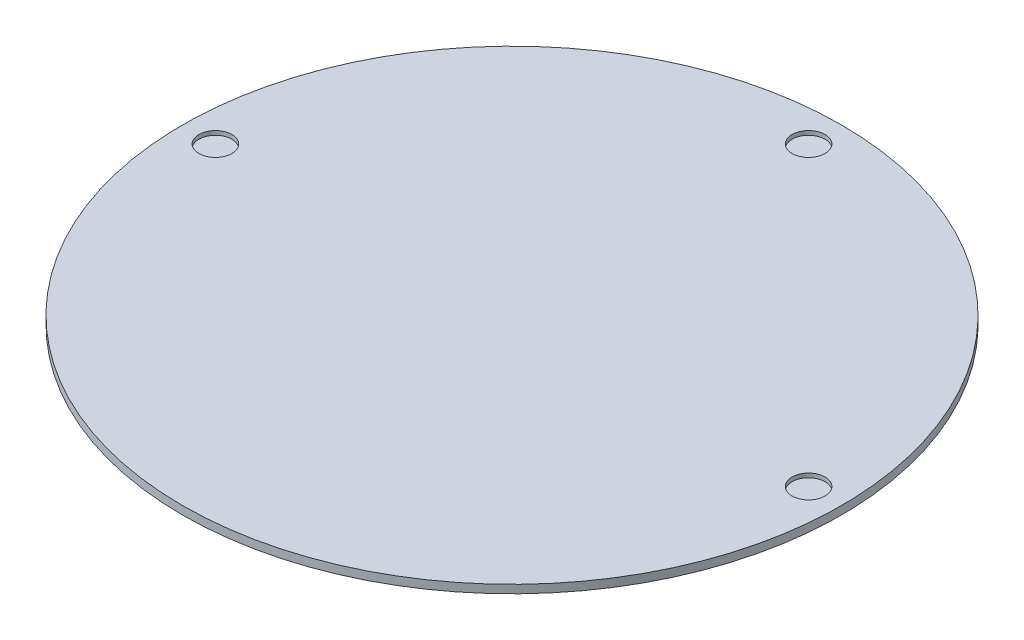
ISO-10303-21;
HEADER;
FILE_DESCRIPTION(('STEP AP214'),'2;1');
FILE_NAME('part.step','',(''),(''),'','','');
FILE_SCHEMA(('AUTOMOTIVE_DESIGN { 1 0 10303 214 1 1 1 1 }'));
ENDSEC;
DATA;
#1=APPLICATION_CONTEXT('core data for automotive mechanical design processes');
#2=APPLICATION_PROTOCOL_DEFINITION('international standard','automotive_design',2000,#1);
#3=PRODUCT_CONTEXT('',#1,'mechanical');
#4=PRODUCT('Part','Part','',(#3));
#5=PRODUCT_RELATED_PRODUCT_CATEGORY('part','',(#4));
#6=PRODUCT_DEFINITION_FORMATION('','',#4);
#7=PRODUCT_DEFINITION_CONTEXT('part definition',#1,'design');
#8=PRODUCT_DEFINITION('design','',#6,#7);
#9=PRODUCT_DEFINITION_SHAPE('','',#8);
#10=(LENGTH_UNIT() NAMED_UNIT(*) SI_UNIT(.MILLI.,.METRE.));
#11=(NAMED_UNIT(*) PLANE_ANGLE_UNIT() SI_UNIT($,.RADIAN.));
#12=(NAMED_UNIT(*) SI_UNIT($,.STERADIAN.) SOLID_ANGLE_UNIT());
#13=UNCERTAINTY_MEASURE_WITH_UNIT(LENGTH_MEASURE(1.E-05),#10,'distance_accuracy_value','');
#14=(GEOMETRIC_REPRESENTATION_CONTEXT(3) GLOBAL_UNCERTAINTY_ASSIGNED_CONTEXT((#13)) GLOBAL_UNIT_ASSIGNED_CONTEXT((#10,
#11,#12)) REPRESENTATION_CONTEXT('',''));
#15=CARTESIAN_POINT('',(0.,0.,0.));
#16=DIRECTION('',(0.,0.,1.));
#17=DIRECTION('',(1.,0.,0.));
#18=AXIS2_PLACEMENT_3D('',#15,#16,#17);
#19=CARTESIAN_POINT('',(0.,10.,0.));
#20=DIRECTION('',(0.,-1.,0.));
#21=DIRECTION('',(0.,0.,-1.));
#22=AXIS2_PLACEMENT_3D('',#19,#20,#21);
#23=CYLINDRICAL_SURFACE('',#22,400.);
#24=CARTESIAN_POINT('',(0.,10.,0.));
#25=DIRECTION('',(0.,1.,0.));
#26=DIRECTION('',(0.,0.,1.));
#27=AXIS2_PLACEMENT_3D('',#24,#25,#26);
#28=CIRCLE('',#27,400.);
#29=CARTESIAN_POINT('',(0.,10.,400.));
#30=VERTEX_POINT('',#29);
#31=EDGE_CURVE('E10',#30,#30,#28,.T.);
#32=ORIENTED_EDGE('',*,*,#31,.F.);
#33=EDGE_LOOP('',(#32));
#34=FACE_BOUND('',#33,.T.);
#35=CARTESIAN_POINT('',(0.,0.,0.));
#36=DIRECTION('',(0.,1.,0.));
#37=DIRECTION('',(0.,0.,1.));
#38=AXIS2_PLACEMENT_3D('',#35,#36,#37);
#39=CIRCLE('',#38,400.);
#40=CARTESIAN_POINT('',(0.,0.,400.));
#41=VERTEX_POINT('',#40);
#42=EDGE_CURVE('E40',#41,#41,#39,.T.);
#43=ORIENTED_EDGE('',*,*,#42,.T.);
#44=EDGE_LOOP('',(#43));
#45=FACE_BOUND('',#44,.T.);
#46=ADVANCED_FACE('F37',(#34,#45),#23,.T.);
#47=CARTESIAN_POINT('',(0.,10.,0.));
#48=DIRECTION('',(0.,1.,0.));
#49=DIRECTION('',(0.,0.,1.));
#50=AXIS2_PLACEMENT_3D('',#47,#48,#49);
#51=PLANE('',#50);
#52=CARTESIAN_POINT('',(0.,10.,-360.));
#53=DIRECTION('',(0.,1.,0.));
#54=DIRECTION('',(0.,0.,1.));
#55=AXIS2_PLACEMENT_3D('',#52,#53,#54);
#56=CIRCLE('',#55,20.);
#57=CARTESIAN_POINT('',(0.,10.,-340.));
#58=VERTEX_POINT('',#57);
#59=EDGE_CURVE('E67',#58,#58,#56,.T.);
#60=ORIENTED_EDGE('',*,*,#59,.F.);
#61=EDGE_LOOP('',(#60));
#62=FACE_BOUND('',#61,.T.);
#63=CARTESIAN_POINT('',(360.,10.,0.));
#64=DIRECTION('',(0.,1.,0.));
#65=DIRECTION('',(0.,0.,1.));
#66=AXIS2_PLACEMENT_3D('',#63,#64,#65);
#67=CIRCLE('',#66,20.);
#68=CARTESIAN_POINT('',(360.,10.,20.));
#69=VERTEX_POINT('',#68);
#70=EDGE_CURVE('E63',#69,#69,#67,.T.);
#71=ORIENTED_EDGE('',*,*,#70,.F.);
#72=EDGE_LOOP('',(#71));
#73=FACE_BOUND('',#72,.T.);
#74=CARTESIAN_POINT('',(-360.,10.,0.));
#75=DIRECTION('',(0.,1.,0.));
#76=DIRECTION('',(0.,0.,1.));
#77=AXIS2_PLACEMENT_3D('',#74,#75,#76);
#78=CIRCLE('',#77,20.);
#79=CARTESIAN_POINT('',(-360.,10.,20.0000000000001));
#80=VERTEX_POINT('',#79);
#81=EDGE_CURVE('E55',#80,#80,#78,.T.);
#82=ORIENTED_EDGE('',*,*,#81,.F.);
#83=EDGE_LOOP('',(#82));
#84=FACE_BOUND('',#83,.T.);
#85=ORIENTED_EDGE('',*,*,#31,.T.);
#86=EDGE_LOOP('',(#85));
#87=FACE_BOUND('',#86,.T.);
#88=ADVANCED_FACE('F84',(#62,#73,#84,#87),#51,.T.);
#89=CARTESIAN_POINT('',(0.,0.,0.));
#90=DIRECTION('',(0.,1.,0.));
#91=DIRECTION('',(0.,0.,1.));
#92=AXIS2_PLACEMENT_3D('',#89,#90,#91);
#93=PLANE('',#92);
#94=ORIENTED_EDGE('',*,*,#42,.F.);
#95=EDGE_LOOP('',(#94));
#96=FACE_BOUND('',#95,.T.);
#97=ADVANCED_FACE('F87',(#96),#93,.F.);
#98=CARTESIAN_POINT('',(-360.,5.,0.));
#99=DIRECTION('',(0.,1.,0.));
#100=DIRECTION('',(0.,0.,1.));
#101=AXIS2_PLACEMENT_3D('',#98,#99,#100);
#102=CYLINDRICAL_SURFACE('',#101,20.);
#103=CARTESIAN_POINT('',(-360.,5.,0.));
#104=DIRECTION('',(0.,1.,0.));
#105=DIRECTION('',(0.,0.,1.));
#106=AXIS2_PLACEMENT_3D('',#103,#104,#105);
#107=CIRCLE('',#106,20.);
#108=CARTESIAN_POINT('',(-360.,5.,20.0000000000001));
#109=VERTEX_POINT('',#108);
#110=EDGE_CURVE('E51',#109,#109,#107,.T.);
#111=ORIENTED_EDGE('',*,*,#110,.F.);
#112=EDGE_LOOP('',(#111));
#113=FACE_BOUND('',#112,.T.);
#114=ORIENTED_EDGE('',*,*,#81,.T.);
#115=EDGE_LOOP('',(#114));
#116=FACE_BOUND('',#115,.T.);
#117=ADVANCED_FACE('F93',(#113,#116),#102,.F.);
#118=CARTESIAN_POINT('',(-360.,5.,0.));
#119=DIRECTION('',(0.,1.,0.));
#120=DIRECTION('',(0.,0.,1.));
#121=AXIS2_PLACEMENT_3D('',#118,#119,#120);
#122=PLANE('',#121);
#123=ORIENTED_EDGE('',*,*,#110,.T.);
#124=EDGE_LOOP('',(#123));
#125=FACE_BOUND('',#124,.T.);
#126=ADVANCED_FACE('F95',(#125),#122,.T.);
#127=CARTESIAN_POINT('',(360.,5.,0.));
#128=DIRECTION('',(0.,1.,0.));
#129=DIRECTION('',(0.,0.,1.));
#130=AXIS2_PLACEMENT_3D('',#127,#128,#129);
#131=CYLINDRICAL_SURFACE('',#130,20.);
#132=CARTESIAN_POINT('',(360.,5.,0.));
#133=DIRECTION('',(0.,1.,0.));
#134=DIRECTION('',(0.,0.,1.));
#135=AXIS2_PLACEMENT_3D('',#132,#133,#134);
#136=CIRCLE('',#135,20.);
#137=CARTESIAN_POINT('',(360.,5.,20.));
#138=VERTEX_POINT('',#137);
#139=EDGE_CURVE('E59',#138,#138,#136,.T.);
#140=ORIENTED_EDGE('',*,*,#139,.F.);
#141=EDGE_LOOP('',(#140));
#142=FACE_BOUND('',#141,.T.);
#143=ORIENTED_EDGE('',*,*,#70,.T.);
#144=EDGE_LOOP('',(#143));
#145=FACE_BOUND('',#144,.T.);
#146=ADVANCED_FACE('F102',(#142,#145),#131,.F.);
#147=CARTESIAN_POINT('',(0.,5.,0.));
#148=DIRECTION('',(0.,1.,0.));
#149=DIRECTION('',(0.,0.,1.));
#150=AXIS2_PLACEMENT_3D('',#147,#148,#149);
#151=PLANE('',#150);
#152=ORIENTED_EDGE('',*,*,#139,.T.);
#153=EDGE_LOOP('',(#152));
#154=FACE_BOUND('',#153,.T.);
#155=ADVANCED_FACE('F80',(#154),#151,.T.);
#156=CARTESIAN_POINT('',(0.,5.,-360.));
#157=DIRECTION('',(0.,1.,0.));
#158=DIRECTION('',(0.,0.,1.));
#159=AXIS2_PLACEMENT_3D('',#156,#157,#158);
#160=CYLINDRICAL_SURFACE('',#159,20.);
#161=CARTESIAN_POINT('',(0.,5.,-360.));
#162=DIRECTION('',(0.,1.,0.));
#163=DIRECTION('',(0.,0.,1.));
#164=AXIS2_PLACEMENT_3D('',#161,#162,#163);
#165=CIRCLE('',#164,20.);
#166=CARTESIAN_POINT('',(0.,5.,-340.));
#167=VERTEX_POINT('',#166);
#168=EDGE_CURVE('E49',#167,#167,#165,.T.);
#169=ORIENTED_EDGE('',*,*,#168,.F.);
#170=EDGE_LOOP('',(#169));
#171=FACE_BOUND('',#170,.T.);
#172=ORIENTED_EDGE('',*,*,#59,.T.);
#173=EDGE_LOOP('',(#172));
#174=FACE_BOUND('',#173,.T.);
#175=ADVANCED_FACE('F77',(#171,#174),#160,.F.);
#176=CARTESIAN_POINT('',(0.,5.,0.));
#177=DIRECTION('',(0.,1.,0.));
#178=DIRECTION('',(0.,0.,1.));
#179=AXIS2_PLACEMENT_3D('',#176,#177,#178);
#180=PLANE('',#179);
#181=ORIENTED_EDGE('',*,*,#168,.T.);
#182=EDGE_LOOP('',(#181));
#183=FACE_BOUND('',#182,.T.);
#184=ADVANCED_FACE('F75',(#183),#180,.T.);
#185=CLOSED_SHELL('',(#46,#88,#97,#117,#126,#146,#155,#175,#184));
#186=MANIFOLD_SOLID_BREP('B2',#185);
#187=ADVANCED_BREP_SHAPE_REPRESENTATION('',(#18,#186),#14);
#188=SHAPE_DEFINITION_REPRESENTATION(#9,#187);
ENDSEC;
END-ISO-10303-21;
